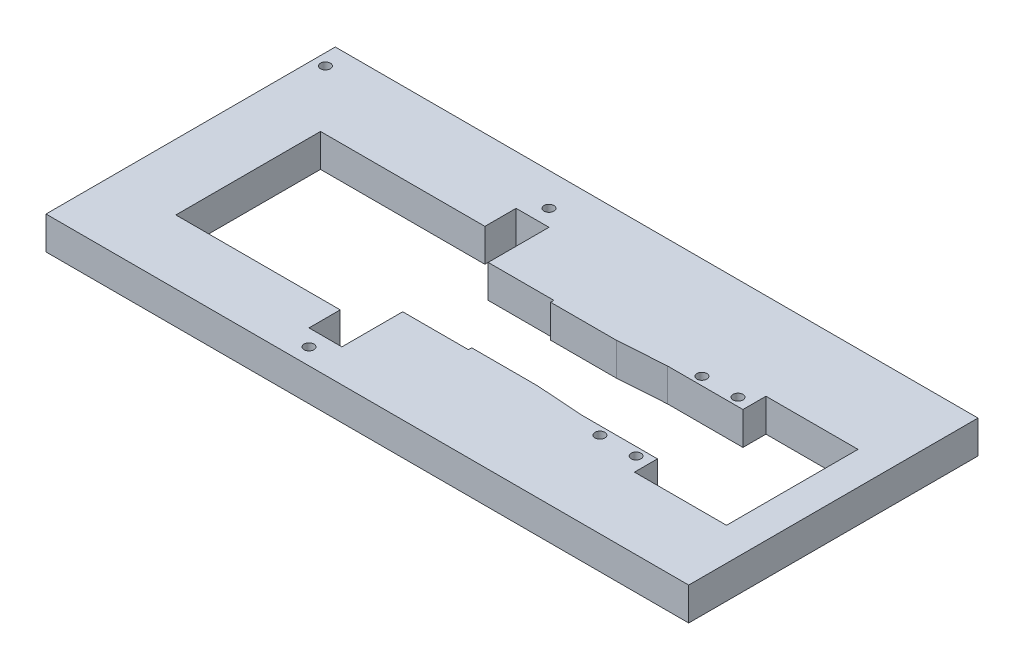
ISO-10303-21;
HEADER;
FILE_DESCRIPTION(('STEP AP214'),'2;1');
FILE_NAME('part.step','',(''),(''),'','','');
FILE_SCHEMA(('AUTOMOTIVE_DESIGN { 1 0 10303 214 1 1 1 1 }'));
ENDSEC;
DATA;
#1=APPLICATION_CONTEXT('core data for automotive mechanical design processes');
#2=APPLICATION_PROTOCOL_DEFINITION('international standard','automotive_design',2000,#1);
#3=PRODUCT_CONTEXT('',#1,'mechanical');
#4=PRODUCT('Part','Part','',(#3));
#5=PRODUCT_RELATED_PRODUCT_CATEGORY('part','',(#4));
#6=PRODUCT_DEFINITION_FORMATION('','',#4);
#7=PRODUCT_DEFINITION_CONTEXT('part definition',#1,'design');
#8=PRODUCT_DEFINITION('design','',#6,#7);
#9=PRODUCT_DEFINITION_SHAPE('','',#8);
#10=(LENGTH_UNIT() NAMED_UNIT(*) SI_UNIT(.MILLI.,.METRE.));
#11=(NAMED_UNIT(*) PLANE_ANGLE_UNIT() SI_UNIT($,.RADIAN.));
#12=(NAMED_UNIT(*) SI_UNIT($,.STERADIAN.) SOLID_ANGLE_UNIT());
#13=UNCERTAINTY_MEASURE_WITH_UNIT(LENGTH_MEASURE(1.E-05),#10,'distance_accuracy_value','');
#14=(GEOMETRIC_REPRESENTATION_CONTEXT(3) GLOBAL_UNCERTAINTY_ASSIGNED_CONTEXT((#13)) GLOBAL_UNIT_ASSIGNED_CONTEXT((#10,
#11,#12)) REPRESENTATION_CONTEXT('',''));
#15=CARTESIAN_POINT('',(0.,0.,0.));
#16=DIRECTION('',(0.,0.,1.));
#17=DIRECTION('',(1.,0.,0.));
#18=AXIS2_PLACEMENT_3D('',#15,#16,#17);
#19=CARTESIAN_POINT('',(0.,10.,0.));
#20=DIRECTION('',(0.,-1.,0.));
#21=DIRECTION('',(0.,0.,-1.));
#22=AXIS2_PLACEMENT_3D('',#19,#20,#21);
#23=PLANE('',#22);
#24=CARTESIAN_POINT('',(5.5,10.,15.5));
#25=DIRECTION('',(0.,1.,0.));
#26=DIRECTION('',(0.,0.,1.));
#27=AXIS2_PLACEMENT_3D('',#24,#25,#26);
#28=CIRCLE('',#27,1.5);
#29=CARTESIAN_POINT('',(5.5,10.,17.));
#30=VERTEX_POINT('',#29);
#31=EDGE_CURVE('E481',#30,#30,#28,.T.);
#32=ORIENTED_EDGE('',*,*,#31,.F.);
#33=EDGE_LOOP('',(#32));
#34=FACE_BOUND('',#33,.T.);
#35=CARTESIAN_POINT('',(-5.5,10.,15.5));
#36=DIRECTION('',(0.,1.,0.));
#37=DIRECTION('',(0.,0.,1.));
#38=AXIS2_PLACEMENT_3D('',#35,#36,#37);
#39=CIRCLE('',#38,1.5);
#40=CARTESIAN_POINT('',(-5.5,10.,17.));
#41=VERTEX_POINT('',#40);
#42=EDGE_CURVE('E489',#41,#41,#39,.T.);
#43=ORIENTED_EDGE('',*,*,#42,.F.);
#44=EDGE_LOOP('',(#43));
#45=FACE_BOUND('',#44,.T.);
#46=CARTESIAN_POINT('',(5.5,10.,-15.5));
#47=DIRECTION('',(0.,1.,0.));
#48=DIRECTION('',(0.,0.,1.));
#49=AXIS2_PLACEMENT_3D('',#46,#47,#48);
#50=CIRCLE('',#49,1.5);
#51=CARTESIAN_POINT('',(5.5,10.,-14.));
#52=VERTEX_POINT('',#51);
#53=EDGE_CURVE('E497',#52,#52,#50,.T.);
#54=ORIENTED_EDGE('',*,*,#53,.F.);
#55=EDGE_LOOP('',(#54));
#56=FACE_BOUND('',#55,.T.);
#57=CARTESIAN_POINT('',(-5.5,10.,-15.5));
#58=DIRECTION('',(0.,1.,0.));
#59=DIRECTION('',(0.,0.,1.));
#60=AXIS2_PLACEMENT_3D('',#57,#58,#59);
#61=CIRCLE('',#60,1.5);
#62=CARTESIAN_POINT('',(-5.5,10.,-14.));
#63=VERTEX_POINT('',#62);
#64=EDGE_CURVE('E505',#63,#63,#61,.T.);
#65=ORIENTED_EDGE('',*,*,#64,.F.);
#66=EDGE_LOOP('',(#65));
#67=FACE_BOUND('',#66,.T.);
#68=DIRECTION('',(0.,0.,-1.));
#69=VECTOR('',#68,1.);
#70=CARTESIAN_POINT('',(47.5,10.,41.5));
#71=LINE('',#70,#69);
#72=CARTESIAN_POINT('',(47.5,10.,41.5));
#73=VERTEX_POINT('',#72);
#74=CARTESIAN_POINT('',(47.5,10.,-46.4999999999999));
#75=VERTEX_POINT('',#74);
#76=EDGE_CURVE('E513',#73,#75,#71,.T.);
#77=ORIENTED_EDGE('',*,*,#76,.T.);
#78=DIRECTION('',(-1.,0.,0.));
#79=VECTOR('',#78,1.);
#80=CARTESIAN_POINT('',(-148.,10.,-46.4999999999999));
#81=LINE('',#80,#79);
#82=CARTESIAN_POINT('',(-148.,10.,-46.4999999999999));
#83=VERTEX_POINT('',#82);
#84=EDGE_CURVE('E517',#75,#83,#81,.T.);
#85=ORIENTED_EDGE('',*,*,#84,.T.);
#86=DIRECTION('',(0.,0.,1.));
#87=VECTOR('',#86,1.);
#88=CARTESIAN_POINT('',(-148.,10.,41.5));
#89=LINE('',#88,#87);
#90=CARTESIAN_POINT('',(-148.,10.,41.5));
#91=VERTEX_POINT('',#90);
#92=EDGE_CURVE('E521',#83,#91,#89,.T.);
#93=ORIENTED_EDGE('',*,*,#92,.T.);
#94=DIRECTION('',(1.,0.,0.));
#95=VECTOR('',#94,1.);
#96=CARTESIAN_POINT('',(-148.,10.,41.5));
#97=LINE('',#96,#95);
#98=EDGE_CURVE('E524',#91,#73,#97,.T.);
#99=ORIENTED_EDGE('',*,*,#98,.T.);
#100=EDGE_LOOP('',(#77,#85,#93,#99));
#101=FACE_BOUND('',#100,.T.);
#102=DIRECTION('',(0.,0.,-1.));
#103=VECTOR('',#102,1.);
#104=CARTESIAN_POINT('',(37.5,10.,20.));
#105=LINE('',#104,#103);
#106=CARTESIAN_POINT('',(37.5,10.,20.));
#107=VERTEX_POINT('',#106);
#108=CARTESIAN_POINT('',(37.5,10.,-20.));
#109=VERTEX_POINT('',#108);
#110=EDGE_CURVE('E229',#107,#109,#105,.T.);
#111=ORIENTED_EDGE('',*,*,#110,.F.);
#112=DIRECTION('',(1.,0.,0.));
#113=VECTOR('',#112,1.);
#114=CARTESIAN_POINT('',(9.5,10.,20.));
#115=LINE('',#114,#113);
#116=CARTESIAN_POINT('',(9.5,10.,20.));
#117=VERTEX_POINT('',#116);
#118=EDGE_CURVE('E320',#117,#107,#115,.T.);
#119=ORIENTED_EDGE('',*,*,#118,.F.);
#120=DIRECTION('',(0.,0.,1.));
#121=VECTOR('',#120,1.);
#122=CARTESIAN_POINT('',(9.5,10.,20.));
#123=LINE('',#122,#121);
#124=CARTESIAN_POINT('',(9.5,10.,13.));
#125=VERTEX_POINT('',#124);
#126=EDGE_CURVE('E317',#125,#117,#123,.T.);
#127=ORIENTED_EDGE('',*,*,#126,.F.);
#128=DIRECTION('',(1.,0.,0.));
#129=VECTOR('',#128,1.);
#130=CARTESIAN_POINT('',(-13.5,10.,13.));
#131=LINE('',#130,#129);
#132=CARTESIAN_POINT('',(-13.5,10.,13.));
#133=VERTEX_POINT('',#132);
#134=EDGE_CURVE('E314',#133,#125,#131,.T.);
#135=ORIENTED_EDGE('',*,*,#134,.F.);
#136=DIRECTION('',(0.997630328422983,0.,0.0688020916153789));
#137=VECTOR('',#136,1.);
#138=CARTESIAN_POINT('',(-13.5,10.,13.));
#139=LINE('',#138,#137);
#140=CARTESIAN_POINT('',(-28.,10.,12.));
#141=VERTEX_POINT('',#140);
#142=EDGE_CURVE('E311',#141,#133,#139,.T.);
#143=ORIENTED_EDGE('',*,*,#142,.F.);
#144=DIRECTION('',(1.,0.,0.));
#145=VECTOR('',#144,1.);
#146=CARTESIAN_POINT('',(-28.,10.,12.));
#147=LINE('',#146,#145);
#148=CARTESIAN_POINT('',(-48.,10.,12.));
#149=VERTEX_POINT('',#148);
#150=EDGE_CURVE('E308',#149,#141,#147,.T.);
#151=ORIENTED_EDGE('',*,*,#150,.F.);
#152=DIRECTION('',(0.,0.,-1.));
#153=VECTOR('',#152,1.);
#154=CARTESIAN_POINT('',(-48.,10.,12.));
#155=LINE('',#154,#153);
#156=CARTESIAN_POINT('',(-48.,10.,13.));
#157=VERTEX_POINT('',#156);
#158=EDGE_CURVE('E305',#157,#149,#155,.T.);
#159=ORIENTED_EDGE('',*,*,#158,.F.);
#160=DIRECTION('',(1.,0.,0.));
#161=VECTOR('',#160,1.);
#162=CARTESIAN_POINT('',(-48.,10.,13.));
#163=LINE('',#162,#161);
#164=CARTESIAN_POINT('',(-68.,10.,13.));
#165=VERTEX_POINT('',#164);
#166=EDGE_CURVE('E302',#165,#157,#163,.T.);
#167=ORIENTED_EDGE('',*,*,#166,.F.);
#168=DIRECTION('',(0.,0.,-1.));
#169=VECTOR('',#168,1.);
#170=CARTESIAN_POINT('',(-68.,10.,31.5));
#171=LINE('',#170,#169);
#172=CARTESIAN_POINT('',(-68.,10.,31.5));
#173=VERTEX_POINT('',#172);
#174=EDGE_CURVE('E299',#173,#165,#171,.T.);
#175=ORIENTED_EDGE('',*,*,#174,.F.);
#176=DIRECTION('',(1.,0.,0.));
#177=VECTOR('',#176,1.);
#178=CARTESIAN_POINT('',(-68.,10.,31.5));
#179=LINE('',#178,#177);
#180=CARTESIAN_POINT('',(-78.,10.,31.5));
#181=VERTEX_POINT('',#180);
#182=EDGE_CURVE('E296',#181,#173,#179,.T.);
#183=ORIENTED_EDGE('',*,*,#182,.F.);
#184=DIRECTION('',(0.,0.,1.));
#185=VECTOR('',#184,1.);
#186=CARTESIAN_POINT('',(-78.,10.,31.5));
#187=LINE('',#186,#185);
#188=CARTESIAN_POINT('',(-78.,10.,22.));
#189=VERTEX_POINT('',#188);
#190=EDGE_CURVE('E293',#189,#181,#187,.T.);
#191=ORIENTED_EDGE('',*,*,#190,.F.);
#192=DIRECTION('',(1.,0.,0.));
#193=VECTOR('',#192,1.);
#194=CARTESIAN_POINT('',(-128.,10.,22.));
#195=LINE('',#194,#193);
#196=CARTESIAN_POINT('',(-128.,10.,22.));
#197=VERTEX_POINT('',#196);
#198=EDGE_CURVE('E290',#197,#189,#195,.T.);
#199=ORIENTED_EDGE('',*,*,#198,.F.);
#200=DIRECTION('',(0.,0.,1.));
#201=VECTOR('',#200,1.);
#202=CARTESIAN_POINT('',(-128.,10.,22.));
#203=LINE('',#202,#201);
#204=CARTESIAN_POINT('',(-128.,10.,-22.));
#205=VERTEX_POINT('',#204);
#206=EDGE_CURVE('E287',#205,#197,#203,.T.);
#207=ORIENTED_EDGE('',*,*,#206,.F.);
#208=DIRECTION('',(-1.,0.,0.));
#209=VECTOR('',#208,1.);
#210=CARTESIAN_POINT('',(-128.,10.,-22.));
#211=LINE('',#210,#209);
#212=CARTESIAN_POINT('',(-78.,10.,-22.));
#213=VERTEX_POINT('',#212);
#214=EDGE_CURVE('E284',#213,#205,#211,.T.);
#215=ORIENTED_EDGE('',*,*,#214,.F.);
#216=DIRECTION('',(0.,0.,1.));
#217=VECTOR('',#216,1.);
#218=CARTESIAN_POINT('',(-78.,10.,-22.));
#219=LINE('',#218,#217);
#220=CARTESIAN_POINT('',(-78.,10.,-31.4999999999999));
#221=VERTEX_POINT('',#220);
#222=EDGE_CURVE('E281',#221,#213,#219,.T.);
#223=ORIENTED_EDGE('',*,*,#222,.F.);
#224=DIRECTION('',(-1.,0.,0.));
#225=VECTOR('',#224,1.);
#226=CARTESIAN_POINT('',(-68.,10.,-31.4999999999999));
#227=LINE('',#226,#225);
#228=CARTESIAN_POINT('',(-68.,10.,-31.4999999999999));
#229=VERTEX_POINT('',#228);
#230=EDGE_CURVE('E278',#229,#221,#227,.T.);
#231=ORIENTED_EDGE('',*,*,#230,.F.);
#232=DIRECTION('',(0.,0.,-1.));
#233=VECTOR('',#232,1.);
#234=CARTESIAN_POINT('',(-68.,10.,-13.));
#235=LINE('',#234,#233);
#236=CARTESIAN_POINT('',(-68.,10.,-13.));
#237=VERTEX_POINT('',#236);
#238=EDGE_CURVE('E275',#237,#229,#235,.T.);
#239=ORIENTED_EDGE('',*,*,#238,.F.);
#240=DIRECTION('',(-1.,0.,0.));
#241=VECTOR('',#240,1.);
#242=CARTESIAN_POINT('',(-48.,10.,-13.));
#243=LINE('',#242,#241);
#244=CARTESIAN_POINT('',(-48.,10.,-13.));
#245=VERTEX_POINT('',#244);
#246=EDGE_CURVE('E272',#245,#237,#243,.T.);
#247=ORIENTED_EDGE('',*,*,#246,.F.);
#248=DIRECTION('',(0.,0.,-1.));
#249=VECTOR('',#248,1.);
#250=CARTESIAN_POINT('',(-48.,10.,-13.));
#251=LINE('',#250,#249);
#252=CARTESIAN_POINT('',(-48.,10.,-12.));
#253=VERTEX_POINT('',#252);
#254=EDGE_CURVE('E269',#253,#245,#251,.T.);
#255=ORIENTED_EDGE('',*,*,#254,.F.);
#256=DIRECTION('',(-1.,0.,0.));
#257=VECTOR('',#256,1.);
#258=CARTESIAN_POINT('',(-28.,10.,-12.));
#259=LINE('',#258,#257);
#260=CARTESIAN_POINT('',(-28.,10.,-12.));
#261=VERTEX_POINT('',#260);
#262=EDGE_CURVE('E266',#261,#253,#259,.T.);
#263=ORIENTED_EDGE('',*,*,#262,.F.);
#264=DIRECTION('',(-0.997630328422983,0.,0.0688020916153782));
#265=VECTOR('',#264,1.);
#266=CARTESIAN_POINT('',(-13.5,10.,-13.));
#267=LINE('',#266,#265);
#268=CARTESIAN_POINT('',(-13.5,10.,-13.));
#269=VERTEX_POINT('',#268);
#270=EDGE_CURVE('E263',#269,#261,#267,.T.);
#271=ORIENTED_EDGE('',*,*,#270,.F.);
#272=DIRECTION('',(-1.,0.,0.));
#273=VECTOR('',#272,1.);
#274=CARTESIAN_POINT('',(-13.5,10.,-13.));
#275=LINE('',#274,#273);
#276=CARTESIAN_POINT('',(9.5,10.,-13.));
#277=VERTEX_POINT('',#276);
#278=EDGE_CURVE('E257',#277,#269,#275,.T.);
#279=ORIENTED_EDGE('',*,*,#278,.F.);
#280=DIRECTION('',(0.,0.,1.));
#281=VECTOR('',#280,1.);
#282=CARTESIAN_POINT('',(9.5,10.,-13.));
#283=LINE('',#282,#281);
#284=CARTESIAN_POINT('',(9.5,10.,-20.));
#285=VERTEX_POINT('',#284);
#286=EDGE_CURVE('E253',#285,#277,#283,.T.);
#287=ORIENTED_EDGE('',*,*,#286,.F.);
#288=DIRECTION('',(-1.,0.,0.));
#289=VECTOR('',#288,1.);
#290=CARTESIAN_POINT('',(9.5,10.,-20.));
#291=LINE('',#290,#289);
#292=EDGE_CURVE('E238',#109,#285,#291,.T.);
#293=ORIENTED_EDGE('',*,*,#292,.F.);
#294=EDGE_LOOP('',(#111,#119,#127,#135,#143,#151,#159,#167,#175,#183,#191,#199,#207,#215,#223,
#231,#239,#247,#255,#263,#271,#279,#287,#293));
#295=FACE_BOUND('',#294,.T.);
#296=CARTESIAN_POINT('',(-73.,10.,36.5));
#297=DIRECTION('',(0.,1.,0.));
#298=DIRECTION('',(0.,0.,1.));
#299=AXIS2_PLACEMENT_3D('',#296,#297,#298);
#300=CIRCLE('',#299,1.5);
#301=CARTESIAN_POINT('',(-73.,10.,38.));
#302=VERTEX_POINT('',#301);
#303=EDGE_CURVE('E325',#302,#302,#300,.T.);
#304=ORIENTED_EDGE('',*,*,#303,.F.);
#305=EDGE_LOOP('',(#304));
#306=FACE_BOUND('',#305,.T.);
#307=CARTESIAN_POINT('',(-73.,10.,-36.4999999999999));
#308=DIRECTION('',(0.,1.,0.));
#309=DIRECTION('',(0.,0.,1.));
#310=AXIS2_PLACEMENT_3D('',#307,#308,#309);
#311=CIRCLE('',#310,1.5);
#312=CARTESIAN_POINT('',(-73.,10.,-35.));
#313=VERTEX_POINT('',#312);
#314=EDGE_CURVE('E621',#313,#313,#311,.T.);
#315=ORIENTED_EDGE('',*,*,#314,.F.);
#316=EDGE_LOOP('',(#315));
#317=FACE_BOUND('',#316,.T.);
#318=CARTESIAN_POINT('',(-144.5,10.,-40.));
#319=DIRECTION('',(0.,1.,0.));
#320=DIRECTION('',(0.,0.,1.));
#321=AXIS2_PLACEMENT_3D('',#318,#319,#320);
#322=CIRCLE('',#321,1.5);
#323=CARTESIAN_POINT('',(-144.5,10.,-38.5));
#324=VERTEX_POINT('',#323);
#325=EDGE_CURVE('E614',#324,#324,#322,.T.);
#326=ORIENTED_EDGE('',*,*,#325,.F.);
#327=EDGE_LOOP('',(#326));
#328=FACE_BOUND('',#327,.T.);
#329=ADVANCED_FACE('F43',(#34,#45,#56,#67,#101,#295,#306,#317,#328),#23,.F.);
#330=CARTESIAN_POINT('',(0.,0.,0.));
#331=DIRECTION('',(0.,-1.,0.));
#332=DIRECTION('',(0.,0.,-1.));
#333=AXIS2_PLACEMENT_3D('',#330,#331,#332);
#334=PLANE('',#333);
#335=CARTESIAN_POINT('',(-73.,0.,-36.4999999999999));
#336=DIRECTION('',(0.,1.,0.));
#337=DIRECTION('',(0.,0.,1.));
#338=AXIS2_PLACEMENT_3D('',#335,#336,#337);
#339=CIRCLE('',#338,1.5);
#340=CARTESIAN_POINT('',(-73.,0.,-35.));
#341=VERTEX_POINT('',#340);
#342=EDGE_CURVE('E618',#341,#341,#339,.T.);
#343=ORIENTED_EDGE('',*,*,#342,.T.);
#344=EDGE_LOOP('',(#343));
#345=FACE_BOUND('',#344,.T.);
#346=DIRECTION('',(1.,0.,0.));
#347=VECTOR('',#346,1.);
#348=CARTESIAN_POINT('',(9.5,0.,20.));
#349=LINE('',#348,#347);
#350=CARTESIAN_POINT('',(9.5,0.,20.));
#351=VERTEX_POINT('',#350);
#352=CARTESIAN_POINT('',(37.5,0.,20.));
#353=VERTEX_POINT('',#352);
#354=EDGE_CURVE('E239',#351,#353,#349,.T.);
#355=ORIENTED_EDGE('',*,*,#354,.T.);
#356=DIRECTION('',(0.,0.,-1.));
#357=VECTOR('',#356,1.);
#358=CARTESIAN_POINT('',(37.5,0.,20.));
#359=LINE('',#358,#357);
#360=CARTESIAN_POINT('',(37.5,0.,-20.));
#361=VERTEX_POINT('',#360);
#362=EDGE_CURVE('E67',#353,#361,#359,.T.);
#363=ORIENTED_EDGE('',*,*,#362,.T.);
#364=DIRECTION('',(-1.,0.,0.));
#365=VECTOR('',#364,1.);
#366=CARTESIAN_POINT('',(9.5,0.,-20.));
#367=LINE('',#366,#365);
#368=CARTESIAN_POINT('',(9.5,0.,-20.));
#369=VERTEX_POINT('',#368);
#370=EDGE_CURVE('E245',#361,#369,#367,.T.);
#371=ORIENTED_EDGE('',*,*,#370,.T.);
#372=DIRECTION('',(0.,0.,1.));
#373=VECTOR('',#372,1.);
#374=CARTESIAN_POINT('',(9.5,0.,-13.));
#375=LINE('',#374,#373);
#376=CARTESIAN_POINT('',(9.5,0.,-13.));
#377=VERTEX_POINT('',#376);
#378=EDGE_CURVE('E328',#369,#377,#375,.T.);
#379=ORIENTED_EDGE('',*,*,#378,.T.);
#380=DIRECTION('',(-1.,0.,0.));
#381=VECTOR('',#380,1.);
#382=CARTESIAN_POINT('',(-13.5,0.,-13.));
#383=LINE('',#382,#381);
#384=CARTESIAN_POINT('',(-13.5,0.,-13.));
#385=VERTEX_POINT('',#384);
#386=EDGE_CURVE('E332',#377,#385,#383,.T.);
#387=ORIENTED_EDGE('',*,*,#386,.T.);
#388=DIRECTION('',(-0.997630328422983,0.,0.0688020916153782));
#389=VECTOR('',#388,1.);
#390=CARTESIAN_POINT('',(-13.5,0.,-13.));
#391=LINE('',#390,#389);
#392=CARTESIAN_POINT('',(-28.,0.,-12.));
#393=VERTEX_POINT('',#392);
#394=EDGE_CURVE('E336',#385,#393,#391,.T.);
#395=ORIENTED_EDGE('',*,*,#394,.T.);
#396=DIRECTION('',(-1.,0.,0.));
#397=VECTOR('',#396,1.);
#398=CARTESIAN_POINT('',(-28.,0.,-12.));
#399=LINE('',#398,#397);
#400=CARTESIAN_POINT('',(-48.,0.,-12.));
#401=VERTEX_POINT('',#400);
#402=EDGE_CURVE('E340',#393,#401,#399,.T.);
#403=ORIENTED_EDGE('',*,*,#402,.T.);
#404=DIRECTION('',(0.,0.,-1.));
#405=VECTOR('',#404,1.);
#406=CARTESIAN_POINT('',(-48.,0.,-13.));
#407=LINE('',#406,#405);
#408=CARTESIAN_POINT('',(-48.,0.,-13.));
#409=VERTEX_POINT('',#408);
#410=EDGE_CURVE('E344',#401,#409,#407,.T.);
#411=ORIENTED_EDGE('',*,*,#410,.T.);
#412=DIRECTION('',(-1.,0.,0.));
#413=VECTOR('',#412,1.);
#414=CARTESIAN_POINT('',(-48.,0.,-13.));
#415=LINE('',#414,#413);
#416=CARTESIAN_POINT('',(-68.,0.,-13.));
#417=VERTEX_POINT('',#416);
#418=EDGE_CURVE('E348',#409,#417,#415,.T.);
#419=ORIENTED_EDGE('',*,*,#418,.T.);
#420=DIRECTION('',(0.,0.,-1.));
#421=VECTOR('',#420,1.);
#422=CARTESIAN_POINT('',(-68.,0.,-13.));
#423=LINE('',#422,#421);
#424=CARTESIAN_POINT('',(-68.,0.,-31.4999999999999));
#425=VERTEX_POINT('',#424);
#426=EDGE_CURVE('E352',#417,#425,#423,.T.);
#427=ORIENTED_EDGE('',*,*,#426,.T.);
#428=DIRECTION('',(-1.,0.,0.));
#429=VECTOR('',#428,1.);
#430=CARTESIAN_POINT('',(-68.,0.,-31.4999999999999));
#431=LINE('',#430,#429);
#432=CARTESIAN_POINT('',(-78.,0.,-31.4999999999999));
#433=VERTEX_POINT('',#432);
#434=EDGE_CURVE('E356',#425,#433,#431,.T.);
#435=ORIENTED_EDGE('',*,*,#434,.T.);
#436=DIRECTION('',(0.,0.,1.));
#437=VECTOR('',#436,1.);
#438=CARTESIAN_POINT('',(-78.,0.,-22.));
#439=LINE('',#438,#437);
#440=CARTESIAN_POINT('',(-78.,0.,-22.));
#441=VERTEX_POINT('',#440);
#442=EDGE_CURVE('E360',#433,#441,#439,.T.);
#443=ORIENTED_EDGE('',*,*,#442,.T.);
#444=DIRECTION('',(-1.,0.,0.));
#445=VECTOR('',#444,1.);
#446=CARTESIAN_POINT('',(-128.,0.,-22.));
#447=LINE('',#446,#445);
#448=CARTESIAN_POINT('',(-128.,0.,-22.));
#449=VERTEX_POINT('',#448);
#450=EDGE_CURVE('E364',#441,#449,#447,.T.);
#451=ORIENTED_EDGE('',*,*,#450,.T.);
#452=DIRECTION('',(0.,0.,1.));
#453=VECTOR('',#452,1.);
#454=CARTESIAN_POINT('',(-128.,0.,22.));
#455=LINE('',#454,#453);
#456=CARTESIAN_POINT('',(-128.,0.,22.));
#457=VERTEX_POINT('',#456);
#458=EDGE_CURVE('E368',#449,#457,#455,.T.);
#459=ORIENTED_EDGE('',*,*,#458,.T.);
#460=DIRECTION('',(1.,0.,0.));
#461=VECTOR('',#460,1.);
#462=CARTESIAN_POINT('',(-128.,0.,22.));
#463=LINE('',#462,#461);
#464=CARTESIAN_POINT('',(-78.,0.,22.));
#465=VERTEX_POINT('',#464);
#466=EDGE_CURVE('E372',#457,#465,#463,.T.);
#467=ORIENTED_EDGE('',*,*,#466,.T.);
#468=DIRECTION('',(0.,0.,1.));
#469=VECTOR('',#468,1.);
#470=CARTESIAN_POINT('',(-78.,0.,31.5));
#471=LINE('',#470,#469);
#472=CARTESIAN_POINT('',(-78.,0.,31.5));
#473=VERTEX_POINT('',#472);
#474=EDGE_CURVE('E376',#465,#473,#471,.T.);
#475=ORIENTED_EDGE('',*,*,#474,.T.);
#476=DIRECTION('',(1.,0.,0.));
#477=VECTOR('',#476,1.);
#478=CARTESIAN_POINT('',(-68.,0.,31.5));
#479=LINE('',#478,#477);
#480=CARTESIAN_POINT('',(-68.,0.,31.5));
#481=VERTEX_POINT('',#480);
#482=EDGE_CURVE('E380',#473,#481,#479,.T.);
#483=ORIENTED_EDGE('',*,*,#482,.T.);
#484=DIRECTION('',(0.,0.,-1.));
#485=VECTOR('',#484,1.);
#486=CARTESIAN_POINT('',(-68.,0.,31.5));
#487=LINE('',#486,#485);
#488=CARTESIAN_POINT('',(-68.,0.,13.));
#489=VERTEX_POINT('',#488);
#490=EDGE_CURVE('E384',#481,#489,#487,.T.);
#491=ORIENTED_EDGE('',*,*,#490,.T.);
#492=DIRECTION('',(1.,0.,0.));
#493=VECTOR('',#492,1.);
#494=CARTESIAN_POINT('',(-48.,0.,13.));
#495=LINE('',#494,#493);
#496=CARTESIAN_POINT('',(-48.,0.,13.));
#497=VERTEX_POINT('',#496);
#498=EDGE_CURVE('E388',#489,#497,#495,.T.);
#499=ORIENTED_EDGE('',*,*,#498,.T.);
#500=DIRECTION('',(0.,0.,-1.));
#501=VECTOR('',#500,1.);
#502=CARTESIAN_POINT('',(-48.,0.,12.));
#503=LINE('',#502,#501);
#504=CARTESIAN_POINT('',(-48.,0.,12.));
#505=VERTEX_POINT('',#504);
#506=EDGE_CURVE('E392',#497,#505,#503,.T.);
#507=ORIENTED_EDGE('',*,*,#506,.T.);
#508=DIRECTION('',(1.,0.,0.));
#509=VECTOR('',#508,1.);
#510=CARTESIAN_POINT('',(-28.,0.,12.));
#511=LINE('',#510,#509);
#512=CARTESIAN_POINT('',(-28.,0.,12.));
#513=VERTEX_POINT('',#512);
#514=EDGE_CURVE('E396',#505,#513,#511,.T.);
#515=ORIENTED_EDGE('',*,*,#514,.T.);
#516=DIRECTION('',(0.997630328422983,0.,0.0688020916153789));
#517=VECTOR('',#516,1.);
#518=CARTESIAN_POINT('',(-13.5,0.,13.));
#519=LINE('',#518,#517);
#520=CARTESIAN_POINT('',(-13.5,0.,13.));
#521=VERTEX_POINT('',#520);
#522=EDGE_CURVE('E400',#513,#521,#519,.T.);
#523=ORIENTED_EDGE('',*,*,#522,.T.);
#524=DIRECTION('',(1.,0.,0.));
#525=VECTOR('',#524,1.);
#526=CARTESIAN_POINT('',(-13.5,0.,13.));
#527=LINE('',#526,#525);
#528=CARTESIAN_POINT('',(9.5,0.,13.));
#529=VERTEX_POINT('',#528);
#530=EDGE_CURVE('E404',#521,#529,#527,.T.);
#531=ORIENTED_EDGE('',*,*,#530,.T.);
#532=DIRECTION('',(0.,0.,1.));
#533=VECTOR('',#532,1.);
#534=CARTESIAN_POINT('',(9.5,0.,20.));
#535=LINE('',#534,#533);
#536=EDGE_CURVE('E408',#529,#351,#535,.T.);
#537=ORIENTED_EDGE('',*,*,#536,.T.);
#538=EDGE_LOOP('',(#355,#363,#371,#379,#387,#395,#403,#411,#419,#427,#435,#443,#451,#459,#467,
#475,#483,#491,#499,#507,#515,#523,#531,#537));
#539=FACE_BOUND('',#538,.T.);
#540=CARTESIAN_POINT('',(5.5,0.,15.5));
#541=DIRECTION('',(0.,1.,0.));
#542=DIRECTION('',(0.,0.,1.));
#543=AXIS2_PLACEMENT_3D('',#540,#541,#542);
#544=CIRCLE('',#543,1.5);
#545=CARTESIAN_POINT('',(5.5,0.,17.));
#546=VERTEX_POINT('',#545);
#547=EDGE_CURVE('E247',#546,#546,#544,.T.);
#548=ORIENTED_EDGE('',*,*,#547,.T.);
#549=EDGE_LOOP('',(#548));
#550=FACE_BOUND('',#549,.T.);
#551=CARTESIAN_POINT('',(5.5,0.,-15.5));
#552=DIRECTION('',(0.,1.,0.));
#553=DIRECTION('',(0.,0.,1.));
#554=AXIS2_PLACEMENT_3D('',#551,#552,#553);
#555=CIRCLE('',#554,1.5);
#556=CARTESIAN_POINT('',(5.5,0.,-14.));
#557=VERTEX_POINT('',#556);
#558=EDGE_CURVE('E493',#557,#557,#555,.T.);
#559=ORIENTED_EDGE('',*,*,#558,.T.);
#560=EDGE_LOOP('',(#559));
#561=FACE_BOUND('',#560,.T.);
#562=DIRECTION('',(0.,0.,-1.));
#563=VECTOR('',#562,1.);
#564=CARTESIAN_POINT('',(47.5,0.,41.5));
#565=LINE('',#564,#563);
#566=CARTESIAN_POINT('',(47.5,0.,41.5));
#567=VERTEX_POINT('',#566);
#568=CARTESIAN_POINT('',(47.5,0.,-46.4999999999999));
#569=VERTEX_POINT('',#568);
#570=EDGE_CURVE('E509',#567,#569,#565,.T.);
#571=ORIENTED_EDGE('',*,*,#570,.F.);
#572=DIRECTION('',(1.,0.,0.));
#573=VECTOR('',#572,1.);
#574=CARTESIAN_POINT('',(-148.,0.,41.5));
#575=LINE('',#574,#573);
#576=CARTESIAN_POINT('',(-148.,0.,41.5));
#577=VERTEX_POINT('',#576);
#578=EDGE_CURVE('E518',#577,#567,#575,.T.);
#579=ORIENTED_EDGE('',*,*,#578,.F.);
#580=DIRECTION('',(0.,0.,1.));
#581=VECTOR('',#580,1.);
#582=CARTESIAN_POINT('',(-148.,0.,41.5));
#583=LINE('',#582,#581);
#584=CARTESIAN_POINT('',(-148.,0.,-46.4999999999999));
#585=VERTEX_POINT('',#584);
#586=EDGE_CURVE('E534',#585,#577,#583,.T.);
#587=ORIENTED_EDGE('',*,*,#586,.F.);
#588=DIRECTION('',(-1.,0.,0.));
#589=VECTOR('',#588,1.);
#590=CARTESIAN_POINT('',(-148.,0.,-46.4999999999999));
#591=LINE('',#590,#589);
#592=EDGE_CURVE('E531',#569,#585,#591,.T.);
#593=ORIENTED_EDGE('',*,*,#592,.F.);
#594=EDGE_LOOP('',(#571,#579,#587,#593));
#595=FACE_BOUND('',#594,.T.);
#596=CARTESIAN_POINT('',(-5.5,0.,-15.5));
#597=DIRECTION('',(0.,1.,0.));
#598=DIRECTION('',(0.,0.,1.));
#599=AXIS2_PLACEMENT_3D('',#596,#597,#598);
#600=CIRCLE('',#599,1.5);
#601=CARTESIAN_POINT('',(-5.5,0.,-14.));
#602=VERTEX_POINT('',#601);
#603=EDGE_CURVE('E501',#602,#602,#600,.T.);
#604=ORIENTED_EDGE('',*,*,#603,.T.);
#605=EDGE_LOOP('',(#604));
#606=FACE_BOUND('',#605,.T.);
#607=CARTESIAN_POINT('',(-5.5,0.,15.5));
#608=DIRECTION('',(0.,1.,0.));
#609=DIRECTION('',(0.,0.,1.));
#610=AXIS2_PLACEMENT_3D('',#607,#608,#609);
#611=CIRCLE('',#610,1.5);
#612=CARTESIAN_POINT('',(-5.5,0.,17.));
#613=VERTEX_POINT('',#612);
#614=EDGE_CURVE('E485',#613,#613,#611,.T.);
#615=ORIENTED_EDGE('',*,*,#614,.T.);
#616=EDGE_LOOP('',(#615));
#617=FACE_BOUND('',#616,.T.);
#618=CARTESIAN_POINT('',(-73.,0.,36.5));
#619=DIRECTION('',(0.,1.,0.));
#620=DIRECTION('',(0.,0.,1.));
#621=AXIS2_PLACEMENT_3D('',#618,#619,#620);
#622=CIRCLE('',#621,1.5);
#623=CARTESIAN_POINT('',(-73.,0.,38.));
#624=VERTEX_POINT('',#623);
#625=EDGE_CURVE('E608',#624,#624,#622,.T.);
#626=ORIENTED_EDGE('',*,*,#625,.T.);
#627=EDGE_LOOP('',(#626));
#628=FACE_BOUND('',#627,.T.);
#629=CARTESIAN_POINT('',(-144.5,0.,-40.));
#630=DIRECTION('',(0.,1.,0.));
#631=DIRECTION('',(0.,0.,1.));
#632=AXIS2_PLACEMENT_3D('',#629,#630,#631);
#633=CIRCLE('',#632,1.5);
#634=CARTESIAN_POINT('',(-144.5,0.,-38.5));
#635=VERTEX_POINT('',#634);
#636=EDGE_CURVE('E611',#635,#635,#633,.T.);
#637=ORIENTED_EDGE('',*,*,#636,.T.);
#638=EDGE_LOOP('',(#637));
#639=FACE_BOUND('',#638,.T.);
#640=ADVANCED_FACE('F557',(#345,#539,#550,#561,#595,#606,#617,#628,#639),#334,.T.);
#641=CARTESIAN_POINT('',(47.5,10.,41.5));
#642=DIRECTION('',(-1.,0.,0.));
#643=DIRECTION('',(0.,0.,1.));
#644=AXIS2_PLACEMENT_3D('',#641,#642,#643);
#645=PLANE('',#644);
#646=ORIENTED_EDGE('',*,*,#570,.T.);
#647=DIRECTION('',(0.,-1.,0.));
#648=VECTOR('',#647,1.);
#649=CARTESIAN_POINT('',(47.5,10.,-46.4999999999999));
#650=LINE('',#649,#648);
#651=EDGE_CURVE('E11',#75,#569,#650,.T.);
#652=ORIENTED_EDGE('',*,*,#651,.F.);
#653=ORIENTED_EDGE('',*,*,#76,.F.);
#654=DIRECTION('',(0.,-1.,0.));
#655=VECTOR('',#654,1.);
#656=CARTESIAN_POINT('',(47.5,10.,41.5));
#657=LINE('',#656,#655);
#658=EDGE_CURVE('E527',#73,#567,#657,.T.);
#659=ORIENTED_EDGE('',*,*,#658,.T.);
#660=EDGE_LOOP('',(#646,#652,#653,#659));
#661=FACE_BOUND('',#660,.T.);
#662=ADVANCED_FACE('F45',(#661),#645,.F.);
#663=CARTESIAN_POINT('',(-148.,10.,-46.4999999999999));
#664=DIRECTION('',(0.,0.,1.));
#665=DIRECTION('',(1.,0.,0.));
#666=AXIS2_PLACEMENT_3D('',#663,#664,#665);
#667=PLANE('',#666);
#668=ORIENTED_EDGE('',*,*,#592,.T.);
#669=DIRECTION('',(0.,-1.,0.));
#670=VECTOR('',#669,1.);
#671=CARTESIAN_POINT('',(-148.,10.,-46.4999999999999));
#672=LINE('',#671,#670);
#673=EDGE_CURVE('E52',#83,#585,#672,.T.);
#674=ORIENTED_EDGE('',*,*,#673,.F.);
#675=ORIENTED_EDGE('',*,*,#84,.F.);
#676=ORIENTED_EDGE('',*,*,#651,.T.);
#677=EDGE_LOOP('',(#668,#674,#675,#676));
#678=FACE_BOUND('',#677,.T.);
#679=ADVANCED_FACE('F567',(#678),#667,.F.);
#680=CARTESIAN_POINT('',(-148.,10.,41.5));
#681=DIRECTION('',(1.,0.,0.));
#682=DIRECTION('',(0.,0.,-1.));
#683=AXIS2_PLACEMENT_3D('',#680,#681,#682);
#684=PLANE('',#683);
#685=ORIENTED_EDGE('',*,*,#586,.T.);
#686=DIRECTION('',(0.,-1.,0.));
#687=VECTOR('',#686,1.);
#688=CARTESIAN_POINT('',(-148.,10.,41.5));
#689=LINE('',#688,#687);
#690=EDGE_CURVE('E542',#91,#577,#689,.T.);
#691=ORIENTED_EDGE('',*,*,#690,.F.);
#692=ORIENTED_EDGE('',*,*,#92,.F.);
#693=ORIENTED_EDGE('',*,*,#673,.T.);
#694=EDGE_LOOP('',(#685,#691,#692,#693));
#695=FACE_BOUND('',#694,.T.);
#696=ADVANCED_FACE('F551',(#695),#684,.F.);
#697=CARTESIAN_POINT('',(-148.,10.,41.5));
#698=DIRECTION('',(0.,0.,-1.));
#699=DIRECTION('',(-1.,0.,0.));
#700=AXIS2_PLACEMENT_3D('',#697,#698,#699);
#701=PLANE('',#700);
#702=ORIENTED_EDGE('',*,*,#578,.T.);
#703=ORIENTED_EDGE('',*,*,#658,.F.);
#704=ORIENTED_EDGE('',*,*,#98,.F.);
#705=ORIENTED_EDGE('',*,*,#690,.T.);
#706=EDGE_LOOP('',(#702,#703,#704,#705));
#707=FACE_BOUND('',#706,.T.);
#708=ADVANCED_FACE('F561',(#707),#701,.F.);
#709=CARTESIAN_POINT('',(-5.5,10.,-15.5));
#710=DIRECTION('',(0.,-1.,0.));
#711=DIRECTION('',(0.,0.,-1.));
#712=AXIS2_PLACEMENT_3D('',#709,#710,#711);
#713=CYLINDRICAL_SURFACE('',#712,1.5);
#714=ORIENTED_EDGE('',*,*,#64,.T.);
#715=EDGE_LOOP('',(#714));
#716=FACE_BOUND('',#715,.T.);
#717=ORIENTED_EDGE('',*,*,#603,.F.);
#718=EDGE_LOOP('',(#717));
#719=FACE_BOUND('',#718,.T.);
#720=ADVANCED_FACE('F585',(#716,#719),#713,.F.);
#721=CARTESIAN_POINT('',(5.5,10.,-15.5));
#722=DIRECTION('',(0.,-1.,0.));
#723=DIRECTION('',(0.,0.,-1.));
#724=AXIS2_PLACEMENT_3D('',#721,#722,#723);
#725=CYLINDRICAL_SURFACE('',#724,1.5);
#726=ORIENTED_EDGE('',*,*,#53,.T.);
#727=EDGE_LOOP('',(#726));
#728=FACE_BOUND('',#727,.T.);
#729=ORIENTED_EDGE('',*,*,#558,.F.);
#730=EDGE_LOOP('',(#729));
#731=FACE_BOUND('',#730,.T.);
#732=ADVANCED_FACE('F592',(#728,#731),#725,.F.);
#733=CARTESIAN_POINT('',(-5.5,10.,15.5));
#734=DIRECTION('',(0.,-1.,0.));
#735=DIRECTION('',(0.,0.,-1.));
#736=AXIS2_PLACEMENT_3D('',#733,#734,#735);
#737=CYLINDRICAL_SURFACE('',#736,1.5);
#738=ORIENTED_EDGE('',*,*,#42,.T.);
#739=EDGE_LOOP('',(#738));
#740=FACE_BOUND('',#739,.T.);
#741=ORIENTED_EDGE('',*,*,#614,.F.);
#742=EDGE_LOOP('',(#741));
#743=FACE_BOUND('',#742,.T.);
#744=ADVANCED_FACE('F597',(#740,#743),#737,.F.);
#745=CARTESIAN_POINT('',(5.5,10.,15.5));
#746=DIRECTION('',(0.,-1.,0.));
#747=DIRECTION('',(0.,0.,-1.));
#748=AXIS2_PLACEMENT_3D('',#745,#746,#747);
#749=CYLINDRICAL_SURFACE('',#748,1.5);
#750=ORIENTED_EDGE('',*,*,#31,.T.);
#751=EDGE_LOOP('',(#750));
#752=FACE_BOUND('',#751,.T.);
#753=ORIENTED_EDGE('',*,*,#547,.F.);
#754=EDGE_LOOP('',(#753));
#755=FACE_BOUND('',#754,.T.);
#756=ADVANCED_FACE('F743',(#752,#755),#749,.F.);
#757=CARTESIAN_POINT('',(37.5,10.,20.));
#758=DIRECTION('',(-1.,0.,0.));
#759=DIRECTION('',(0.,0.,1.));
#760=AXIS2_PLACEMENT_3D('',#757,#758,#759);
#761=PLANE('',#760);
#762=ORIENTED_EDGE('',*,*,#362,.F.);
#763=DIRECTION('',(0.,-1.,0.));
#764=VECTOR('',#763,1.);
#765=CARTESIAN_POINT('',(37.5,10.,20.));
#766=LINE('',#765,#764);
#767=EDGE_CURVE('E233',#107,#353,#766,.T.);
#768=ORIENTED_EDGE('',*,*,#767,.F.);
#769=ORIENTED_EDGE('',*,*,#110,.T.);
#770=DIRECTION('',(0.,-1.,0.));
#771=VECTOR('',#770,1.);
#772=CARTESIAN_POINT('',(37.5,10.,-20.));
#773=LINE('',#772,#771);
#774=EDGE_CURVE('E232',#109,#361,#773,.T.);
#775=ORIENTED_EDGE('',*,*,#774,.T.);
#776=EDGE_LOOP('',(#762,#768,#769,#775));
#777=FACE_BOUND('',#776,.T.);
#778=ADVANCED_FACE('F231',(#777),#761,.T.);
#779=CARTESIAN_POINT('',(9.5,10.,-20.));
#780=DIRECTION('',(0.,0.,1.));
#781=DIRECTION('',(1.,0.,0.));
#782=AXIS2_PLACEMENT_3D('',#779,#780,#781);
#783=PLANE('',#782);
#784=ORIENTED_EDGE('',*,*,#370,.F.);
#785=ORIENTED_EDGE('',*,*,#774,.F.);
#786=ORIENTED_EDGE('',*,*,#292,.T.);
#787=DIRECTION('',(0.,-1.,0.));
#788=VECTOR('',#787,1.);
#789=CARTESIAN_POINT('',(9.5,10.,-20.));
#790=LINE('',#789,#788);
#791=EDGE_CURVE('E248',#285,#369,#790,.T.);
#792=ORIENTED_EDGE('',*,*,#791,.T.);
#793=EDGE_LOOP('',(#784,#785,#786,#792));
#794=FACE_BOUND('',#793,.T.);
#795=ADVANCED_FACE('F242',(#794),#783,.T.);
#796=CARTESIAN_POINT('',(9.5,10.,-13.));
#797=DIRECTION('',(1.,0.,0.));
#798=DIRECTION('',(0.,0.,-1.));
#799=AXIS2_PLACEMENT_3D('',#796,#797,#798);
#800=PLANE('',#799);
#801=ORIENTED_EDGE('',*,*,#378,.F.);
#802=ORIENTED_EDGE('',*,*,#791,.F.);
#803=ORIENTED_EDGE('',*,*,#286,.T.);
#804=DIRECTION('',(0.,-1.,0.));
#805=VECTOR('',#804,1.);
#806=CARTESIAN_POINT('',(9.5,10.,-13.));
#807=LINE('',#806,#805);
#808=EDGE_CURVE('E476',#277,#377,#807,.T.);
#809=ORIENTED_EDGE('',*,*,#808,.T.);
#810=EDGE_LOOP('',(#801,#802,#803,#809));
#811=FACE_BOUND('',#810,.T.);
#812=ADVANCED_FACE('F734',(#811),#800,.T.);
#813=CARTESIAN_POINT('',(-13.5,10.,-13.));
#814=DIRECTION('',(0.,0.,1.));
#815=DIRECTION('',(1.,0.,0.));
#816=AXIS2_PLACEMENT_3D('',#813,#814,#815);
#817=PLANE('',#816);
#818=ORIENTED_EDGE('',*,*,#386,.F.);
#819=ORIENTED_EDGE('',*,*,#808,.F.);
#820=ORIENTED_EDGE('',*,*,#278,.T.);
#821=DIRECTION('',(0.,-1.,0.));
#822=VECTOR('',#821,1.);
#823=CARTESIAN_POINT('',(-13.5,10.,-13.));
#824=LINE('',#823,#822);
#825=EDGE_CURVE('E473',#269,#385,#824,.T.);
#826=ORIENTED_EDGE('',*,*,#825,.T.);
#827=EDGE_LOOP('',(#818,#819,#820,#826));
#828=FACE_BOUND('',#827,.T.);
#829=ADVANCED_FACE('F730',(#828),#817,.T.);
#830=CARTESIAN_POINT('',(-13.5,10.,-13.));
#831=DIRECTION('',(0.0688020916153782,0.,0.997630328422983));
#832=DIRECTION('',(0.997630328422983,0.,-0.0688020916153782));
#833=AXIS2_PLACEMENT_3D('',#830,#831,#832);
#834=PLANE('',#833);
#835=ORIENTED_EDGE('',*,*,#394,.F.);
#836=ORIENTED_EDGE('',*,*,#825,.F.);
#837=ORIENTED_EDGE('',*,*,#270,.T.);
#838=DIRECTION('',(0.,-1.,0.));
#839=VECTOR('',#838,1.);
#840=CARTESIAN_POINT('',(-28.,10.,-12.));
#841=LINE('',#840,#839);
#842=EDGE_CURVE('E470',#261,#393,#841,.T.);
#843=ORIENTED_EDGE('',*,*,#842,.T.);
#844=EDGE_LOOP('',(#835,#836,#837,#843));
#845=FACE_BOUND('',#844,.T.);
#846=ADVANCED_FACE('F726',(#845),#834,.T.);
#847=CARTESIAN_POINT('',(-28.,10.,-12.));
#848=DIRECTION('',(0.,0.,1.));
#849=DIRECTION('',(1.,0.,0.));
#850=AXIS2_PLACEMENT_3D('',#847,#848,#849);
#851=PLANE('',#850);
#852=ORIENTED_EDGE('',*,*,#402,.F.);
#853=ORIENTED_EDGE('',*,*,#842,.F.);
#854=ORIENTED_EDGE('',*,*,#262,.T.);
#855=DIRECTION('',(0.,-1.,0.));
#856=VECTOR('',#855,1.);
#857=CARTESIAN_POINT('',(-48.,10.,-12.));
#858=LINE('',#857,#856);
#859=EDGE_CURVE('E467',#253,#401,#858,.T.);
#860=ORIENTED_EDGE('',*,*,#859,.T.);
#861=EDGE_LOOP('',(#852,#853,#854,#860));
#862=FACE_BOUND('',#861,.T.);
#863=ADVANCED_FACE('F722',(#862),#851,.T.);
#864=CARTESIAN_POINT('',(-48.,10.,-13.));
#865=DIRECTION('',(-1.,0.,0.));
#866=DIRECTION('',(0.,0.,1.));
#867=AXIS2_PLACEMENT_3D('',#864,#865,#866);
#868=PLANE('',#867);
#869=ORIENTED_EDGE('',*,*,#410,.F.);
#870=ORIENTED_EDGE('',*,*,#859,.F.);
#871=ORIENTED_EDGE('',*,*,#254,.T.);
#872=DIRECTION('',(0.,-1.,0.));
#873=VECTOR('',#872,1.);
#874=CARTESIAN_POINT('',(-48.,10.,-13.));
#875=LINE('',#874,#873);
#876=EDGE_CURVE('E464',#245,#409,#875,.T.);
#877=ORIENTED_EDGE('',*,*,#876,.T.);
#878=EDGE_LOOP('',(#869,#870,#871,#877));
#879=FACE_BOUND('',#878,.T.);
#880=ADVANCED_FACE('F718',(#879),#868,.T.);
#881=CARTESIAN_POINT('',(-48.,10.,-13.));
#882=DIRECTION('',(0.,0.,1.));
#883=DIRECTION('',(1.,0.,0.));
#884=AXIS2_PLACEMENT_3D('',#881,#882,#883);
#885=PLANE('',#884);
#886=ORIENTED_EDGE('',*,*,#418,.F.);
#887=ORIENTED_EDGE('',*,*,#876,.F.);
#888=ORIENTED_EDGE('',*,*,#246,.T.);
#889=DIRECTION('',(0.,-1.,0.));
#890=VECTOR('',#889,1.);
#891=CARTESIAN_POINT('',(-68.,10.,-13.));
#892=LINE('',#891,#890);
#893=EDGE_CURVE('E461',#237,#417,#892,.T.);
#894=ORIENTED_EDGE('',*,*,#893,.T.);
#895=EDGE_LOOP('',(#886,#887,#888,#894));
#896=FACE_BOUND('',#895,.T.);
#897=ADVANCED_FACE('F714',(#896),#885,.T.);
#898=CARTESIAN_POINT('',(-68.,10.,-13.));
#899=DIRECTION('',(-1.,0.,0.));
#900=DIRECTION('',(0.,0.,1.));
#901=AXIS2_PLACEMENT_3D('',#898,#899,#900);
#902=PLANE('',#901);
#903=ORIENTED_EDGE('',*,*,#426,.F.);
#904=ORIENTED_EDGE('',*,*,#893,.F.);
#905=ORIENTED_EDGE('',*,*,#238,.T.);
#906=DIRECTION('',(0.,-1.,0.));
#907=VECTOR('',#906,1.);
#908=CARTESIAN_POINT('',(-68.,10.,-31.4999999999999));
#909=LINE('',#908,#907);
#910=EDGE_CURVE('E458',#229,#425,#909,.T.);
#911=ORIENTED_EDGE('',*,*,#910,.T.);
#912=EDGE_LOOP('',(#903,#904,#905,#911));
#913=FACE_BOUND('',#912,.T.);
#914=ADVANCED_FACE('F710',(#913),#902,.T.);
#915=CARTESIAN_POINT('',(-68.,10.,-31.4999999999999));
#916=DIRECTION('',(0.,0.,1.));
#917=DIRECTION('',(1.,0.,0.));
#918=AXIS2_PLACEMENT_3D('',#915,#916,#917);
#919=PLANE('',#918);
#920=ORIENTED_EDGE('',*,*,#434,.F.);
#921=ORIENTED_EDGE('',*,*,#910,.F.);
#922=ORIENTED_EDGE('',*,*,#230,.T.);
#923=DIRECTION('',(0.,-1.,0.));
#924=VECTOR('',#923,1.);
#925=CARTESIAN_POINT('',(-78.,10.,-31.4999999999999));
#926=LINE('',#925,#924);
#927=EDGE_CURVE('E455',#221,#433,#926,.T.);
#928=ORIENTED_EDGE('',*,*,#927,.T.);
#929=EDGE_LOOP('',(#920,#921,#922,#928));
#930=FACE_BOUND('',#929,.T.);
#931=ADVANCED_FACE('F706',(#930),#919,.T.);
#932=CARTESIAN_POINT('',(-78.,10.,-22.));
#933=DIRECTION('',(1.,0.,0.));
#934=DIRECTION('',(0.,0.,-1.));
#935=AXIS2_PLACEMENT_3D('',#932,#933,#934);
#936=PLANE('',#935);
#937=ORIENTED_EDGE('',*,*,#442,.F.);
#938=ORIENTED_EDGE('',*,*,#927,.F.);
#939=ORIENTED_EDGE('',*,*,#222,.T.);
#940=DIRECTION('',(0.,-1.,0.));
#941=VECTOR('',#940,1.);
#942=CARTESIAN_POINT('',(-78.,10.,-22.));
#943=LINE('',#942,#941);
#944=EDGE_CURVE('E452',#213,#441,#943,.T.);
#945=ORIENTED_EDGE('',*,*,#944,.T.);
#946=EDGE_LOOP('',(#937,#938,#939,#945));
#947=FACE_BOUND('',#946,.T.);
#948=ADVANCED_FACE('F702',(#947),#936,.T.);
#949=CARTESIAN_POINT('',(-128.,10.,-22.));
#950=DIRECTION('',(0.,0.,1.));
#951=DIRECTION('',(1.,0.,0.));
#952=AXIS2_PLACEMENT_3D('',#949,#950,#951);
#953=PLANE('',#952);
#954=ORIENTED_EDGE('',*,*,#450,.F.);
#955=ORIENTED_EDGE('',*,*,#944,.F.);
#956=ORIENTED_EDGE('',*,*,#214,.T.);
#957=DIRECTION('',(0.,-1.,0.));
#958=VECTOR('',#957,1.);
#959=CARTESIAN_POINT('',(-128.,10.,-22.));
#960=LINE('',#959,#958);
#961=EDGE_CURVE('E449',#205,#449,#960,.T.);
#962=ORIENTED_EDGE('',*,*,#961,.T.);
#963=EDGE_LOOP('',(#954,#955,#956,#962));
#964=FACE_BOUND('',#963,.T.);
#965=ADVANCED_FACE('F698',(#964),#953,.T.);
#966=CARTESIAN_POINT('',(-128.,10.,22.));
#967=DIRECTION('',(1.,0.,0.));
#968=DIRECTION('',(0.,0.,-1.));
#969=AXIS2_PLACEMENT_3D('',#966,#967,#968);
#970=PLANE('',#969);
#971=ORIENTED_EDGE('',*,*,#458,.F.);
#972=ORIENTED_EDGE('',*,*,#961,.F.);
#973=ORIENTED_EDGE('',*,*,#206,.T.);
#974=DIRECTION('',(0.,-1.,0.));
#975=VECTOR('',#974,1.);
#976=CARTESIAN_POINT('',(-128.,10.,22.));
#977=LINE('',#976,#975);
#978=EDGE_CURVE('E446',#197,#457,#977,.T.);
#979=ORIENTED_EDGE('',*,*,#978,.T.);
#980=EDGE_LOOP('',(#971,#972,#973,#979));
#981=FACE_BOUND('',#980,.T.);
#982=ADVANCED_FACE('F694',(#981),#970,.T.);
#983=CARTESIAN_POINT('',(-128.,10.,22.));
#984=DIRECTION('',(0.,0.,-1.));
#985=DIRECTION('',(-1.,0.,0.));
#986=AXIS2_PLACEMENT_3D('',#983,#984,#985);
#987=PLANE('',#986);
#988=ORIENTED_EDGE('',*,*,#466,.F.);
#989=ORIENTED_EDGE('',*,*,#978,.F.);
#990=ORIENTED_EDGE('',*,*,#198,.T.);
#991=DIRECTION('',(0.,-1.,0.));
#992=VECTOR('',#991,1.);
#993=CARTESIAN_POINT('',(-78.,10.,22.));
#994=LINE('',#993,#992);
#995=EDGE_CURVE('E443',#189,#465,#994,.T.);
#996=ORIENTED_EDGE('',*,*,#995,.T.);
#997=EDGE_LOOP('',(#988,#989,#990,#996));
#998=FACE_BOUND('',#997,.T.);
#999=ADVANCED_FACE('F690',(#998),#987,.T.);
#1000=CARTESIAN_POINT('',(-78.,10.,31.5));
#1001=DIRECTION('',(1.,0.,0.));
#1002=DIRECTION('',(0.,0.,-1.));
#1003=AXIS2_PLACEMENT_3D('',#1000,#1001,#1002);
#1004=PLANE('',#1003);
#1005=ORIENTED_EDGE('',*,*,#474,.F.);
#1006=ORIENTED_EDGE('',*,*,#995,.F.);
#1007=ORIENTED_EDGE('',*,*,#190,.T.);
#1008=DIRECTION('',(0.,-1.,0.));
#1009=VECTOR('',#1008,1.);
#1010=CARTESIAN_POINT('',(-78.,10.,31.5));
#1011=LINE('',#1010,#1009);
#1012=EDGE_CURVE('E440',#181,#473,#1011,.T.);
#1013=ORIENTED_EDGE('',*,*,#1012,.T.);
#1014=EDGE_LOOP('',(#1005,#1006,#1007,#1013));
#1015=FACE_BOUND('',#1014,.T.);
#1016=ADVANCED_FACE('F686',(#1015),#1004,.T.);
#1017=CARTESIAN_POINT('',(-68.,10.,31.5));
#1018=DIRECTION('',(0.,0.,-1.));
#1019=DIRECTION('',(-1.,0.,0.));
#1020=AXIS2_PLACEMENT_3D('',#1017,#1018,#1019);
#1021=PLANE('',#1020);
#1022=ORIENTED_EDGE('',*,*,#482,.F.);
#1023=ORIENTED_EDGE('',*,*,#1012,.F.);
#1024=ORIENTED_EDGE('',*,*,#182,.T.);
#1025=DIRECTION('',(0.,-1.,0.));
#1026=VECTOR('',#1025,1.);
#1027=CARTESIAN_POINT('',(-68.,10.,31.5));
#1028=LINE('',#1027,#1026);
#1029=EDGE_CURVE('E437',#173,#481,#1028,.T.);
#1030=ORIENTED_EDGE('',*,*,#1029,.T.);
#1031=EDGE_LOOP('',(#1022,#1023,#1024,#1030));
#1032=FACE_BOUND('',#1031,.T.);
#1033=ADVANCED_FACE('F682',(#1032),#1021,.T.);
#1034=CARTESIAN_POINT('',(-68.,10.,31.5));
#1035=DIRECTION('',(-1.,0.,0.));
#1036=DIRECTION('',(0.,0.,1.));
#1037=AXIS2_PLACEMENT_3D('',#1034,#1035,#1036);
#1038=PLANE('',#1037);
#1039=ORIENTED_EDGE('',*,*,#490,.F.);
#1040=ORIENTED_EDGE('',*,*,#1029,.F.);
#1041=ORIENTED_EDGE('',*,*,#174,.T.);
#1042=DIRECTION('',(0.,-1.,0.));
#1043=VECTOR('',#1042,1.);
#1044=CARTESIAN_POINT('',(-68.,10.,13.));
#1045=LINE('',#1044,#1043);
#1046=EDGE_CURVE('E434',#165,#489,#1045,.T.);
#1047=ORIENTED_EDGE('',*,*,#1046,.T.);
#1048=EDGE_LOOP('',(#1039,#1040,#1041,#1047));
#1049=FACE_BOUND('',#1048,.T.);
#1050=ADVANCED_FACE('F678',(#1049),#1038,.T.);
#1051=CARTESIAN_POINT('',(-48.,10.,13.));
#1052=DIRECTION('',(0.,0.,-1.));
#1053=DIRECTION('',(-1.,0.,0.));
#1054=AXIS2_PLACEMENT_3D('',#1051,#1052,#1053);
#1055=PLANE('',#1054);
#1056=ORIENTED_EDGE('',*,*,#498,.F.);
#1057=ORIENTED_EDGE('',*,*,#1046,.F.);
#1058=ORIENTED_EDGE('',*,*,#166,.T.);
#1059=DIRECTION('',(0.,-1.,0.));
#1060=VECTOR('',#1059,1.);
#1061=CARTESIAN_POINT('',(-48.,10.,13.));
#1062=LINE('',#1061,#1060);
#1063=EDGE_CURVE('E431',#157,#497,#1062,.T.);
#1064=ORIENTED_EDGE('',*,*,#1063,.T.);
#1065=EDGE_LOOP('',(#1056,#1057,#1058,#1064));
#1066=FACE_BOUND('',#1065,.T.);
#1067=ADVANCED_FACE('F674',(#1066),#1055,.T.);
#1068=CARTESIAN_POINT('',(-48.,10.,12.));
#1069=DIRECTION('',(-1.,0.,0.));
#1070=DIRECTION('',(0.,0.,1.));
#1071=AXIS2_PLACEMENT_3D('',#1068,#1069,#1070);
#1072=PLANE('',#1071);
#1073=ORIENTED_EDGE('',*,*,#506,.F.);
#1074=ORIENTED_EDGE('',*,*,#1063,.F.);
#1075=ORIENTED_EDGE('',*,*,#158,.T.);
#1076=DIRECTION('',(0.,-1.,0.));
#1077=VECTOR('',#1076,1.);
#1078=CARTESIAN_POINT('',(-48.,10.,12.));
#1079=LINE('',#1078,#1077);
#1080=EDGE_CURVE('E428',#149,#505,#1079,.T.);
#1081=ORIENTED_EDGE('',*,*,#1080,.T.);
#1082=EDGE_LOOP('',(#1073,#1074,#1075,#1081));
#1083=FACE_BOUND('',#1082,.T.);
#1084=ADVANCED_FACE('F670',(#1083),#1072,.T.);
#1085=CARTESIAN_POINT('',(-28.,10.,12.));
#1086=DIRECTION('',(0.,0.,-1.));
#1087=DIRECTION('',(-1.,0.,0.));
#1088=AXIS2_PLACEMENT_3D('',#1085,#1086,#1087);
#1089=PLANE('',#1088);
#1090=ORIENTED_EDGE('',*,*,#514,.F.);
#1091=ORIENTED_EDGE('',*,*,#1080,.F.);
#1092=ORIENTED_EDGE('',*,*,#150,.T.);
#1093=DIRECTION('',(0.,-1.,0.));
#1094=VECTOR('',#1093,1.);
#1095=CARTESIAN_POINT('',(-28.,10.,12.));
#1096=LINE('',#1095,#1094);
#1097=EDGE_CURVE('E425',#141,#513,#1096,.T.);
#1098=ORIENTED_EDGE('',*,*,#1097,.T.);
#1099=EDGE_LOOP('',(#1090,#1091,#1092,#1098));
#1100=FACE_BOUND('',#1099,.T.);
#1101=ADVANCED_FACE('F666',(#1100),#1089,.T.);
#1102=CARTESIAN_POINT('',(-13.5,10.,13.));
#1103=DIRECTION('',(0.0688020916153789,0.,-0.997630328422983));
#1104=DIRECTION('',(-0.997630328422983,0.,-0.0688020916153789));
#1105=AXIS2_PLACEMENT_3D('',#1102,#1103,#1104);
#1106=PLANE('',#1105);
#1107=ORIENTED_EDGE('',*,*,#522,.F.);
#1108=ORIENTED_EDGE('',*,*,#1097,.F.);
#1109=ORIENTED_EDGE('',*,*,#142,.T.);
#1110=DIRECTION('',(0.,-1.,0.));
#1111=VECTOR('',#1110,1.);
#1112=CARTESIAN_POINT('',(-13.5,10.,13.));
#1113=LINE('',#1112,#1111);
#1114=EDGE_CURVE('E422',#133,#521,#1113,.T.);
#1115=ORIENTED_EDGE('',*,*,#1114,.T.);
#1116=EDGE_LOOP('',(#1107,#1108,#1109,#1115));
#1117=FACE_BOUND('',#1116,.T.);
#1118=ADVANCED_FACE('F662',(#1117),#1106,.T.);
#1119=CARTESIAN_POINT('',(-13.5,10.,13.));
#1120=DIRECTION('',(0.,0.,-1.));
#1121=DIRECTION('',(-1.,0.,0.));
#1122=AXIS2_PLACEMENT_3D('',#1119,#1120,#1121);
#1123=PLANE('',#1122);
#1124=ORIENTED_EDGE('',*,*,#530,.F.);
#1125=ORIENTED_EDGE('',*,*,#1114,.F.);
#1126=ORIENTED_EDGE('',*,*,#134,.T.);
#1127=DIRECTION('',(0.,-1.,0.));
#1128=VECTOR('',#1127,1.);
#1129=CARTESIAN_POINT('',(9.5,10.,13.));
#1130=LINE('',#1129,#1128);
#1131=EDGE_CURVE('E419',#125,#529,#1130,.T.);
#1132=ORIENTED_EDGE('',*,*,#1131,.T.);
#1133=EDGE_LOOP('',(#1124,#1125,#1126,#1132));
#1134=FACE_BOUND('',#1133,.T.);
#1135=ADVANCED_FACE('F658',(#1134),#1123,.T.);
#1136=CARTESIAN_POINT('',(9.5,10.,20.));
#1137=DIRECTION('',(1.,0.,0.));
#1138=DIRECTION('',(0.,0.,-1.));
#1139=AXIS2_PLACEMENT_3D('',#1136,#1137,#1138);
#1140=PLANE('',#1139);
#1141=ORIENTED_EDGE('',*,*,#536,.F.);
#1142=ORIENTED_EDGE('',*,*,#1131,.F.);
#1143=ORIENTED_EDGE('',*,*,#126,.T.);
#1144=DIRECTION('',(0.,-1.,0.));
#1145=VECTOR('',#1144,1.);
#1146=CARTESIAN_POINT('',(9.5,10.,20.));
#1147=LINE('',#1146,#1145);
#1148=EDGE_CURVE('E59',#117,#351,#1147,.T.);
#1149=ORIENTED_EDGE('',*,*,#1148,.T.);
#1150=EDGE_LOOP('',(#1141,#1142,#1143,#1149));
#1151=FACE_BOUND('',#1150,.T.);
#1152=ADVANCED_FACE('F655',(#1151),#1140,.T.);
#1153=CARTESIAN_POINT('',(9.5,10.,20.));
#1154=DIRECTION('',(0.,0.,-1.));
#1155=DIRECTION('',(-1.,0.,0.));
#1156=AXIS2_PLACEMENT_3D('',#1153,#1154,#1155);
#1157=PLANE('',#1156);
#1158=ORIENTED_EDGE('',*,*,#354,.F.);
#1159=ORIENTED_EDGE('',*,*,#1148,.F.);
#1160=ORIENTED_EDGE('',*,*,#118,.T.);
#1161=ORIENTED_EDGE('',*,*,#767,.T.);
#1162=EDGE_LOOP('',(#1158,#1159,#1160,#1161));
#1163=FACE_BOUND('',#1162,.T.);
#1164=ADVANCED_FACE('F652',(#1163),#1157,.T.);
#1165=CARTESIAN_POINT('',(-73.,10.,36.5));
#1166=DIRECTION('',(0.,-1.,0.));
#1167=DIRECTION('',(0.,0.,-1.));
#1168=AXIS2_PLACEMENT_3D('',#1165,#1166,#1167);
#1169=CYLINDRICAL_SURFACE('',#1168,1.5);
#1170=ORIENTED_EDGE('',*,*,#303,.T.);
#1171=EDGE_LOOP('',(#1170));
#1172=FACE_BOUND('',#1171,.T.);
#1173=ORIENTED_EDGE('',*,*,#625,.F.);
#1174=EDGE_LOOP('',(#1173));
#1175=FACE_BOUND('',#1174,.T.);
#1176=ADVANCED_FACE('F633',(#1172,#1175),#1169,.F.);
#1177=CARTESIAN_POINT('',(-73.,10.,-36.4999999999999));
#1178=DIRECTION('',(0.,-1.,0.));
#1179=DIRECTION('',(0.,0.,-1.));
#1180=AXIS2_PLACEMENT_3D('',#1177,#1178,#1179);
#1181=CYLINDRICAL_SURFACE('',#1180,1.5);
#1182=ORIENTED_EDGE('',*,*,#314,.T.);
#1183=EDGE_LOOP('',(#1182));
#1184=FACE_BOUND('',#1183,.T.);
#1185=ORIENTED_EDGE('',*,*,#342,.F.);
#1186=EDGE_LOOP('',(#1185));
#1187=FACE_BOUND('',#1186,.T.);
#1188=ADVANCED_FACE('F642',(#1184,#1187),#1181,.F.);
#1189=CARTESIAN_POINT('',(-144.5,10.,-40.));
#1190=DIRECTION('',(0.,-1.,0.));
#1191=DIRECTION('',(0.,0.,-1.));
#1192=AXIS2_PLACEMENT_3D('',#1189,#1190,#1191);
#1193=CYLINDRICAL_SURFACE('',#1192,1.5);
#1194=ORIENTED_EDGE('',*,*,#325,.T.);
#1195=EDGE_LOOP('',(#1194));
#1196=FACE_BOUND('',#1195,.T.);
#1197=ORIENTED_EDGE('',*,*,#636,.F.);
#1198=EDGE_LOOP('',(#1197));
#1199=FACE_BOUND('',#1198,.T.);
#1200=ADVANCED_FACE('F640',(#1196,#1199),#1193,.F.);
#1201=CLOSED_SHELL('',(#329,#640,#662,#679,#696,#708,#720,#732,#744,#756,#778,#795,#812,#829,
#846,#863,#880,#897,#914,#931,#948,#965,#982,#999,#1016,#1033,#1050,#1067,#1084,#1101,#1118,
#1135,#1152,#1164,#1176,#1188,#1200));
#1202=MANIFOLD_SOLID_BREP('B2',#1201);
#1203=ADVANCED_BREP_SHAPE_REPRESENTATION('',(#18,#1202),#14);
#1204=SHAPE_DEFINITION_REPRESENTATION(#9,#1203);
ENDSEC;
END-ISO-10303-21;
